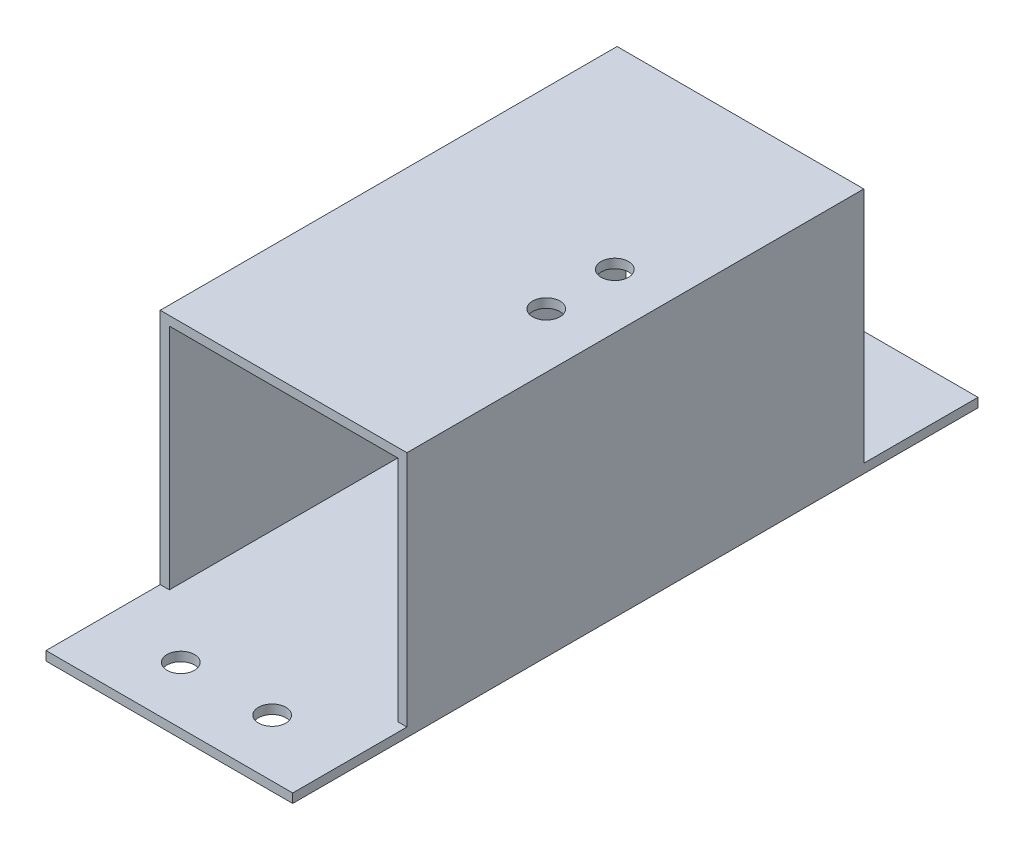
ISO-10303-21;
HEADER;
FILE_DESCRIPTION(('STEP AP214'),'2;1');
FILE_NAME('part.step','',(''),(''),'','','');
FILE_SCHEMA(('AUTOMOTIVE_DESIGN { 1 0 10303 214 1 1 1 1 }'));
ENDSEC;
DATA;
#1=APPLICATION_CONTEXT('core data for automotive mechanical design processes');
#2=APPLICATION_PROTOCOL_DEFINITION('international standard','automotive_design',2000,#1);
#3=PRODUCT_CONTEXT('',#1,'mechanical');
#4=PRODUCT('Part','Part','',(#3));
#5=PRODUCT_RELATED_PRODUCT_CATEGORY('part','',(#4));
#6=PRODUCT_DEFINITION_FORMATION('','',#4);
#7=PRODUCT_DEFINITION_CONTEXT('part definition',#1,'design');
#8=PRODUCT_DEFINITION('design','',#6,#7);
#9=PRODUCT_DEFINITION_SHAPE('','',#8);
#10=(LENGTH_UNIT() NAMED_UNIT(*) SI_UNIT(.MILLI.,.METRE.));
#11=(NAMED_UNIT(*) PLANE_ANGLE_UNIT() SI_UNIT($,.RADIAN.));
#12=(NAMED_UNIT(*) SI_UNIT($,.STERADIAN.) SOLID_ANGLE_UNIT());
#13=UNCERTAINTY_MEASURE_WITH_UNIT(LENGTH_MEASURE(1.E-05),#10,'distance_accuracy_value','');
#14=(GEOMETRIC_REPRESENTATION_CONTEXT(3) GLOBAL_UNCERTAINTY_ASSIGNED_CONTEXT((#13)) GLOBAL_UNIT_ASSIGNED_CONTEXT((#10,
#11,#12)) REPRESENTATION_CONTEXT('',''));
#15=CARTESIAN_POINT('',(0.,0.,0.));
#16=DIRECTION('',(0.,0.,1.));
#17=DIRECTION('',(1.,0.,0.));
#18=AXIS2_PLACEMENT_3D('',#15,#16,#17);
#19=CARTESIAN_POINT('',(0.,0.,50.));
#20=DIRECTION('',(0.,0.,1.));
#21=DIRECTION('',(1.,0.,0.));
#22=AXIS2_PLACEMENT_3D('',#19,#20,#21);
#23=PLANE('',#22);
#24=DIRECTION('',(-1.,0.,0.));
#25=VECTOR('',#24,1.);
#26=CARTESIAN_POINT('',(0.,-25.,50.));
#27=LINE('',#26,#25);
#28=CARTESIAN_POINT('',(27.,-25.,50.));
#29=VERTEX_POINT('',#28);
#30=CARTESIAN_POINT('',(25.,-25.,50.));
#31=VERTEX_POINT('',#30);
#32=EDGE_CURVE('E57',#29,#31,#27,.T.);
#33=ORIENTED_EDGE('',*,*,#32,.F.);
#34=DIRECTION('',(0.,1.,0.));
#35=VECTOR('',#34,1.);
#36=CARTESIAN_POINT('',(27.,-27.,50.));
#37=LINE('',#36,#35);
#38=CARTESIAN_POINT('',(27.,27.,50.));
#39=VERTEX_POINT('',#38);
#40=EDGE_CURVE('E205',#29,#39,#37,.T.);
#41=ORIENTED_EDGE('',*,*,#40,.T.);
#42=DIRECTION('',(-1.,0.,0.));
#43=VECTOR('',#42,1.);
#44=CARTESIAN_POINT('',(27.,27.,50.));
#45=LINE('',#44,#43);
#46=CARTESIAN_POINT('',(-27.,27.,50.));
#47=VERTEX_POINT('',#46);
#48=EDGE_CURVE('E208',#39,#47,#45,.T.);
#49=ORIENTED_EDGE('',*,*,#48,.T.);
#50=DIRECTION('',(0.,-1.,0.));
#51=VECTOR('',#50,1.);
#52=CARTESIAN_POINT('',(-27.,-27.,50.));
#53=LINE('',#52,#51);
#54=CARTESIAN_POINT('',(-27.,-25.,50.));
#55=VERTEX_POINT('',#54);
#56=EDGE_CURVE('E50',#47,#55,#53,.T.);
#57=ORIENTED_EDGE('',*,*,#56,.T.);
#58=CARTESIAN_POINT('',(-25.,-25.,50.));
#59=VERTEX_POINT('',#58);
#60=EDGE_CURVE('E173',#59,#55,#27,.T.);
#61=ORIENTED_EDGE('',*,*,#60,.F.);
#62=DIRECTION('',(0.,-1.,0.));
#63=VECTOR('',#62,1.);
#64=CARTESIAN_POINT('',(-25.,-25.,50.));
#65=LINE('',#64,#63);
#66=CARTESIAN_POINT('',(-25.,25.,50.));
#67=VERTEX_POINT('',#66);
#68=EDGE_CURVE('E176',#67,#59,#65,.T.);
#69=ORIENTED_EDGE('',*,*,#68,.F.);
#70=DIRECTION('',(-1.,0.,0.));
#71=VECTOR('',#70,1.);
#72=CARTESIAN_POINT('',(25.,25.,50.));
#73=LINE('',#72,#71);
#74=CARTESIAN_POINT('',(25.,25.,50.));
#75=VERTEX_POINT('',#74);
#76=EDGE_CURVE('E183',#75,#67,#73,.T.);
#77=ORIENTED_EDGE('',*,*,#76,.F.);
#78=DIRECTION('',(0.,1.,0.));
#79=VECTOR('',#78,1.);
#80=CARTESIAN_POINT('',(25.,-25.,50.));
#81=LINE('',#80,#79);
#82=EDGE_CURVE('E179',#31,#75,#81,.T.);
#83=ORIENTED_EDGE('',*,*,#82,.F.);
#84=EDGE_LOOP('',(#33,#41,#49,#57,#61,#69,#77,#83));
#85=FACE_BOUND('',#84,.T.);
#86=ADVANCED_FACE('F33',(#85),#23,.T.);
#87=CARTESIAN_POINT('',(0.,0.,-50.));
#88=DIRECTION('',(0.,0.,1.));
#89=DIRECTION('',(1.,0.,0.));
#90=AXIS2_PLACEMENT_3D('',#87,#88,#89);
#91=PLANE('',#90);
#92=DIRECTION('',(0.,1.,0.));
#93=VECTOR('',#92,1.);
#94=CARTESIAN_POINT('',(27.,-27.,-50.));
#95=LINE('',#94,#93);
#96=CARTESIAN_POINT('',(27.,-25.,-50.));
#97=VERTEX_POINT('',#96);
#98=CARTESIAN_POINT('',(27.,27.,-50.));
#99=VERTEX_POINT('',#98);
#100=EDGE_CURVE('E212',#97,#99,#95,.T.);
#101=ORIENTED_EDGE('',*,*,#100,.F.);
#102=DIRECTION('',(-1.,0.,0.));
#103=VECTOR('',#102,1.);
#104=CARTESIAN_POINT('',(0.,-25.,-50.));
#105=LINE('',#104,#103);
#106=CARTESIAN_POINT('',(25.,-25.,-50.));
#107=VERTEX_POINT('',#106);
#108=EDGE_CURVE('E171',#97,#107,#105,.T.);
#109=ORIENTED_EDGE('',*,*,#108,.T.);
#110=DIRECTION('',(0.,1.,0.));
#111=VECTOR('',#110,1.);
#112=CARTESIAN_POINT('',(25.,-25.,-50.));
#113=LINE('',#112,#111);
#114=CARTESIAN_POINT('',(25.,25.,-50.));
#115=VERTEX_POINT('',#114);
#116=EDGE_CURVE('E188',#107,#115,#113,.T.);
#117=ORIENTED_EDGE('',*,*,#116,.T.);
#118=DIRECTION('',(-1.,0.,0.));
#119=VECTOR('',#118,1.);
#120=CARTESIAN_POINT('',(25.,25.,-50.));
#121=LINE('',#120,#119);
#122=CARTESIAN_POINT('',(-25.,25.,-50.));
#123=VERTEX_POINT('',#122);
#124=EDGE_CURVE('E180',#115,#123,#121,.T.);
#125=ORIENTED_EDGE('',*,*,#124,.T.);
#126=DIRECTION('',(0.,-1.,0.));
#127=VECTOR('',#126,1.);
#128=CARTESIAN_POINT('',(-25.,-25.,-50.));
#129=LINE('',#128,#127);
#130=CARTESIAN_POINT('',(-25.,-25.,-50.));
#131=VERTEX_POINT('',#130);
#132=EDGE_CURVE('E175',#123,#131,#129,.T.);
#133=ORIENTED_EDGE('',*,*,#132,.T.);
#134=CARTESIAN_POINT('',(-27.,-25.,-50.));
#135=VERTEX_POINT('',#134);
#136=EDGE_CURVE('E166',#131,#135,#105,.T.);
#137=ORIENTED_EDGE('',*,*,#136,.T.);
#138=DIRECTION('',(0.,-1.,0.));
#139=VECTOR('',#138,1.);
#140=CARTESIAN_POINT('',(-27.,-27.,-50.));
#141=LINE('',#140,#139);
#142=CARTESIAN_POINT('',(-27.,27.,-50.));
#143=VERTEX_POINT('',#142);
#144=EDGE_CURVE('E203',#143,#135,#141,.T.);
#145=ORIENTED_EDGE('',*,*,#144,.F.);
#146=DIRECTION('',(-1.,0.,0.));
#147=VECTOR('',#146,1.);
#148=CARTESIAN_POINT('',(27.,27.,-50.));
#149=LINE('',#148,#147);
#150=EDGE_CURVE('E206',#99,#143,#149,.T.);
#151=ORIENTED_EDGE('',*,*,#150,.F.);
#152=EDGE_LOOP('',(#101,#109,#117,#125,#133,#137,#145,#151));
#153=FACE_BOUND('',#152,.T.);
#154=ADVANCED_FACE('F273',(#153),#91,.F.);
#155=CARTESIAN_POINT('',(-27.,-27.,50.));
#156=DIRECTION('',(1.,0.,0.));
#157=DIRECTION('',(0.,0.,-1.));
#158=AXIS2_PLACEMENT_3D('',#155,#156,#157);
#159=PLANE('',#158);
#160=ORIENTED_EDGE('',*,*,#144,.T.);
#161=DIRECTION('',(0.,0.,1.));
#162=VECTOR('',#161,1.);
#163=CARTESIAN_POINT('',(-27.,-25.,-75.));
#164=LINE('',#163,#162);
#165=CARTESIAN_POINT('',(-27.,-25.,-75.));
#166=VERTEX_POINT('',#165);
#167=EDGE_CURVE('E164',#166,#135,#164,.T.);
#168=ORIENTED_EDGE('',*,*,#167,.F.);
#169=DIRECTION('',(0.,-1.,0.));
#170=VECTOR('',#169,1.);
#171=CARTESIAN_POINT('',(-27.,-27.,-75.));
#172=LINE('',#171,#170);
#173=CARTESIAN_POINT('',(-27.,-27.,-75.));
#174=VERTEX_POINT('',#173);
#175=EDGE_CURVE('E129',#166,#174,#172,.T.);
#176=ORIENTED_EDGE('',*,*,#175,.T.);
#177=DIRECTION('',(0.,0.,-1.));
#178=VECTOR('',#177,1.);
#179=CARTESIAN_POINT('',(-27.,-27.,50.));
#180=LINE('',#179,#178);
#181=CARTESIAN_POINT('',(-27.,-27.,75.));
#182=VERTEX_POINT('',#181);
#183=EDGE_CURVE('E11',#182,#174,#180,.T.);
#184=ORIENTED_EDGE('',*,*,#183,.F.);
#185=DIRECTION('',(0.,-1.,0.));
#186=VECTOR('',#185,1.);
#187=CARTESIAN_POINT('',(-27.,-27.,75.));
#188=LINE('',#187,#186);
#189=CARTESIAN_POINT('',(-27.,-25.,75.));
#190=VERTEX_POINT('',#189);
#191=EDGE_CURVE('E127',#190,#182,#188,.T.);
#192=ORIENTED_EDGE('',*,*,#191,.F.);
#193=EDGE_CURVE('E167',#55,#190,#164,.T.);
#194=ORIENTED_EDGE('',*,*,#193,.F.);
#195=ORIENTED_EDGE('',*,*,#56,.F.);
#196=DIRECTION('',(0.,0.,-1.));
#197=VECTOR('',#196,1.);
#198=CARTESIAN_POINT('',(-27.,27.,50.));
#199=LINE('',#198,#197);
#200=EDGE_CURVE('E210',#47,#143,#199,.T.);
#201=ORIENTED_EDGE('',*,*,#200,.T.);
#202=EDGE_LOOP('',(#160,#168,#176,#184,#192,#194,#195,#201));
#203=FACE_BOUND('',#202,.T.);
#204=ADVANCED_FACE('F35',(#203),#159,.F.);
#205=CARTESIAN_POINT('',(27.,-27.,50.));
#206=DIRECTION('',(0.,1.,0.));
#207=DIRECTION('',(-1.,0.,0.));
#208=AXIS2_PLACEMENT_3D('',#205,#206,#207);
#209=PLANE('',#208);
#210=CARTESIAN_POINT('',(-9.99999999999999,-27.,-62.5));
#211=DIRECTION('',(0.,1.,0.));
#212=DIRECTION('',(-1.,0.,0.));
#213=AXIS2_PLACEMENT_3D('',#210,#211,#212);
#214=CIRCLE('',#213,3.);
#215=CARTESIAN_POINT('',(-13.,-27.,-62.5));
#216=VERTEX_POINT('',#215);
#217=EDGE_CURVE('E145',#216,#216,#214,.T.);
#218=ORIENTED_EDGE('',*,*,#217,.T.);
#219=EDGE_LOOP('',(#218));
#220=FACE_BOUND('',#219,.T.);
#221=CARTESIAN_POINT('',(10.,-27.,-62.5));
#222=DIRECTION('',(0.,1.,0.));
#223=DIRECTION('',(-1.,0.,0.));
#224=AXIS2_PLACEMENT_3D('',#221,#222,#223);
#225=CIRCLE('',#224,3.);
#226=CARTESIAN_POINT('',(7.00000000000001,-27.,-62.5));
#227=VERTEX_POINT('',#226);
#228=EDGE_CURVE('E148',#227,#227,#225,.T.);
#229=ORIENTED_EDGE('',*,*,#228,.T.);
#230=EDGE_LOOP('',(#229));
#231=FACE_BOUND('',#230,.T.);
#232=CARTESIAN_POINT('',(10.,-27.,62.5));
#233=DIRECTION('',(0.,1.,0.));
#234=DIRECTION('',(-1.,0.,0.));
#235=AXIS2_PLACEMENT_3D('',#232,#233,#234);
#236=CIRCLE('',#235,3.);
#237=CARTESIAN_POINT('',(7.00000000000001,-27.,62.5));
#238=VERTEX_POINT('',#237);
#239=EDGE_CURVE('E249',#238,#238,#236,.T.);
#240=ORIENTED_EDGE('',*,*,#239,.T.);
#241=EDGE_LOOP('',(#240));
#242=FACE_BOUND('',#241,.T.);
#243=CARTESIAN_POINT('',(-9.99999999999999,-27.,62.5));
#244=DIRECTION('',(0.,1.,0.));
#245=DIRECTION('',(-1.,0.,0.));
#246=AXIS2_PLACEMENT_3D('',#243,#244,#245);
#247=CIRCLE('',#246,3.);
#248=CARTESIAN_POINT('',(-13.,-27.,62.5));
#249=VERTEX_POINT('',#248);
#250=EDGE_CURVE('E246',#249,#249,#247,.T.);
#251=ORIENTED_EDGE('',*,*,#250,.T.);
#252=EDGE_LOOP('',(#251));
#253=FACE_BOUND('',#252,.T.);
#254=ORIENTED_EDGE('',*,*,#183,.T.);
#255=DIRECTION('',(1.,0.,0.));
#256=VECTOR('',#255,1.);
#257=CARTESIAN_POINT('',(-27.,-27.,-75.));
#258=LINE('',#257,#256);
#259=CARTESIAN_POINT('',(27.,-27.,-75.));
#260=VERTEX_POINT('',#259);
#261=EDGE_CURVE('E155',#174,#260,#258,.T.);
#262=ORIENTED_EDGE('',*,*,#261,.T.);
#263=DIRECTION('',(0.,0.,-1.));
#264=VECTOR('',#263,1.);
#265=CARTESIAN_POINT('',(27.,-27.,50.));
#266=LINE('',#265,#264);
#267=CARTESIAN_POINT('',(27.,-27.,75.));
#268=VERTEX_POINT('',#267);
#269=EDGE_CURVE('E42',#268,#260,#266,.T.);
#270=ORIENTED_EDGE('',*,*,#269,.F.);
#271=DIRECTION('',(1.,0.,0.));
#272=VECTOR('',#271,1.);
#273=CARTESIAN_POINT('',(-27.,-27.,75.));
#274=LINE('',#273,#272);
#275=EDGE_CURVE('E134',#182,#268,#274,.T.);
#276=ORIENTED_EDGE('',*,*,#275,.F.);
#277=EDGE_LOOP('',(#254,#262,#270,#276));
#278=FACE_BOUND('',#277,.T.);
#279=ADVANCED_FACE('F135',(#220,#231,#242,#253,#278),#209,.F.);
#280=CARTESIAN_POINT('',(27.,-27.,50.));
#281=DIRECTION('',(-1.,0.,0.));
#282=DIRECTION('',(0.,0.,1.));
#283=AXIS2_PLACEMENT_3D('',#280,#281,#282);
#284=PLANE('',#283);
#285=ORIENTED_EDGE('',*,*,#40,.F.);
#286=DIRECTION('',(0.,0.,1.));
#287=VECTOR('',#286,1.);
#288=CARTESIAN_POINT('',(27.,-25.,-75.));
#289=LINE('',#288,#287);
#290=CARTESIAN_POINT('',(27.,-25.,75.));
#291=VERTEX_POINT('',#290);
#292=EDGE_CURVE('E163',#29,#291,#289,.T.);
#293=ORIENTED_EDGE('',*,*,#292,.T.);
#294=DIRECTION('',(0.,1.,0.));
#295=VECTOR('',#294,1.);
#296=CARTESIAN_POINT('',(27.,-27.,75.));
#297=LINE('',#296,#295);
#298=EDGE_CURVE('E139',#268,#291,#297,.T.);
#299=ORIENTED_EDGE('',*,*,#298,.F.);
#300=ORIENTED_EDGE('',*,*,#269,.T.);
#301=DIRECTION('',(0.,1.,0.));
#302=VECTOR('',#301,1.);
#303=CARTESIAN_POINT('',(27.,-27.,-75.));
#304=LINE('',#303,#302);
#305=CARTESIAN_POINT('',(27.,-25.,-75.));
#306=VERTEX_POINT('',#305);
#307=EDGE_CURVE('E157',#260,#306,#304,.T.);
#308=ORIENTED_EDGE('',*,*,#307,.T.);
#309=EDGE_CURVE('E168',#306,#97,#289,.T.);
#310=ORIENTED_EDGE('',*,*,#309,.T.);
#311=ORIENTED_EDGE('',*,*,#100,.T.);
#312=DIRECTION('',(0.,0.,-1.));
#313=VECTOR('',#312,1.);
#314=CARTESIAN_POINT('',(27.,27.,50.));
#315=LINE('',#314,#313);
#316=EDGE_CURVE('E217',#39,#99,#315,.T.);
#317=ORIENTED_EDGE('',*,*,#316,.F.);
#318=EDGE_LOOP('',(#285,#293,#299,#300,#308,#310,#311,#317));
#319=FACE_BOUND('',#318,.T.);
#320=ADVANCED_FACE('F287',(#319),#284,.F.);
#321=CARTESIAN_POINT('',(27.,27.,50.));
#322=DIRECTION('',(0.,-1.,0.));
#323=DIRECTION('',(1.,0.,0.));
#324=AXIS2_PLACEMENT_3D('',#321,#322,#323);
#325=PLANE('',#324);
#326=CARTESIAN_POINT('',(15.,27.,-7.5));
#327=DIRECTION('',(0.,1.,0.));
#328=DIRECTION('',(-1.,0.,0.));
#329=AXIS2_PLACEMENT_3D('',#326,#327,#328);
#330=CIRCLE('',#329,3.);
#331=CARTESIAN_POINT('',(12.,27.,-7.5));
#332=VERTEX_POINT('',#331);
#333=EDGE_CURVE('E222',#332,#332,#330,.T.);
#334=ORIENTED_EDGE('',*,*,#333,.F.);
#335=EDGE_LOOP('',(#334));
#336=FACE_BOUND('',#335,.T.);
#337=CARTESIAN_POINT('',(15.,27.,7.5));
#338=DIRECTION('',(0.,1.,0.));
#339=DIRECTION('',(-1.,0.,0.));
#340=AXIS2_PLACEMENT_3D('',#337,#338,#339);
#341=CIRCLE('',#340,3.);
#342=CARTESIAN_POINT('',(12.,27.,7.5));
#343=VERTEX_POINT('',#342);
#344=EDGE_CURVE('E228',#343,#343,#341,.T.);
#345=ORIENTED_EDGE('',*,*,#344,.F.);
#346=EDGE_LOOP('',(#345));
#347=FACE_BOUND('',#346,.T.);
#348=ORIENTED_EDGE('',*,*,#150,.T.);
#349=ORIENTED_EDGE('',*,*,#200,.F.);
#350=ORIENTED_EDGE('',*,*,#48,.F.);
#351=ORIENTED_EDGE('',*,*,#316,.T.);
#352=EDGE_LOOP('',(#348,#349,#350,#351));
#353=FACE_BOUND('',#352,.T.);
#354=ADVANCED_FACE('F284',(#336,#347,#353),#325,.F.);
#355=CARTESIAN_POINT('',(-25.,-25.,50.));
#356=DIRECTION('',(1.,0.,0.));
#357=DIRECTION('',(0.,0.,-1.));
#358=AXIS2_PLACEMENT_3D('',#355,#356,#357);
#359=PLANE('',#358);
#360=ORIENTED_EDGE('',*,*,#132,.F.);
#361=DIRECTION('',(0.,0.,-1.));
#362=VECTOR('',#361,1.);
#363=CARTESIAN_POINT('',(-25.,25.,50.));
#364=LINE('',#363,#362);
#365=EDGE_CURVE('E185',#67,#123,#364,.T.);
#366=ORIENTED_EDGE('',*,*,#365,.F.);
#367=ORIENTED_EDGE('',*,*,#68,.T.);
#368=DIRECTION('',(0.,0.,-1.));
#369=VECTOR('',#368,1.);
#370=CARTESIAN_POINT('',(-25.,-25.,50.));
#371=LINE('',#370,#369);
#372=EDGE_CURVE('E200',#59,#131,#371,.T.);
#373=ORIENTED_EDGE('',*,*,#372,.T.);
#374=EDGE_LOOP('',(#360,#366,#367,#373));
#375=FACE_BOUND('',#374,.T.);
#376=ADVANCED_FACE('F281',(#375),#359,.T.);
#377=CARTESIAN_POINT('',(25.,-25.,50.));
#378=DIRECTION('',(0.,1.,0.));
#379=DIRECTION('',(-1.,0.,0.));
#380=AXIS2_PLACEMENT_3D('',#377,#378,#379);
#381=PLANE('',#380);
#382=CARTESIAN_POINT('',(-9.99999999999999,-25.,-62.5));
#383=DIRECTION('',(0.,1.,0.));
#384=DIRECTION('',(1.,0.,0.));
#385=AXIS2_PLACEMENT_3D('',#382,#383,#384);
#386=CIRCLE('',#385,3.);
#387=CARTESIAN_POINT('',(-6.99999999999998,-25.,-62.5));
#388=VERTEX_POINT('',#387);
#389=EDGE_CURVE('E226',#388,#388,#386,.T.);
#390=ORIENTED_EDGE('',*,*,#389,.F.);
#391=EDGE_LOOP('',(#390));
#392=FACE_BOUND('',#391,.T.);
#393=CARTESIAN_POINT('',(10.,-25.,-62.5));
#394=DIRECTION('',(0.,1.,0.));
#395=DIRECTION('',(1.,0.,0.));
#396=AXIS2_PLACEMENT_3D('',#393,#394,#395);
#397=CIRCLE('',#396,3.);
#398=CARTESIAN_POINT('',(13.,-25.,-62.5));
#399=VERTEX_POINT('',#398);
#400=EDGE_CURVE('E239',#399,#399,#397,.T.);
#401=ORIENTED_EDGE('',*,*,#400,.F.);
#402=EDGE_LOOP('',(#401));
#403=FACE_BOUND('',#402,.T.);
#404=CARTESIAN_POINT('',(10.,-25.,62.5));
#405=DIRECTION('',(0.,1.,0.));
#406=DIRECTION('',(-1.,0.,0.));
#407=AXIS2_PLACEMENT_3D('',#404,#405,#406);
#408=CIRCLE('',#407,3.);
#409=CARTESIAN_POINT('',(7.00000000000001,-25.,62.5));
#410=VERTEX_POINT('',#409);
#411=EDGE_CURVE('E235',#410,#410,#408,.T.);
#412=ORIENTED_EDGE('',*,*,#411,.F.);
#413=EDGE_LOOP('',(#412));
#414=FACE_BOUND('',#413,.T.);
#415=CARTESIAN_POINT('',(-9.99999999999999,-25.,62.5));
#416=DIRECTION('',(0.,1.,0.));
#417=DIRECTION('',(-1.,0.,0.));
#418=AXIS2_PLACEMENT_3D('',#415,#416,#417);
#419=CIRCLE('',#418,3.);
#420=CARTESIAN_POINT('',(-13.,-25.,62.5));
#421=VERTEX_POINT('',#420);
#422=EDGE_CURVE('E238',#421,#421,#419,.T.);
#423=ORIENTED_EDGE('',*,*,#422,.F.);
#424=EDGE_LOOP('',(#423));
#425=FACE_BOUND('',#424,.T.);
#426=DIRECTION('',(0.,0.,-1.));
#427=VECTOR('',#426,1.);
#428=CARTESIAN_POINT('',(25.,-25.,50.));
#429=LINE('',#428,#427);
#430=EDGE_CURVE('E197',#31,#107,#429,.T.);
#431=ORIENTED_EDGE('',*,*,#430,.T.);
#432=ORIENTED_EDGE('',*,*,#108,.F.);
#433=ORIENTED_EDGE('',*,*,#309,.F.);
#434=DIRECTION('',(-1.,0.,0.));
#435=VECTOR('',#434,1.);
#436=CARTESIAN_POINT('',(-27.,-25.,-75.));
#437=LINE('',#436,#435);
#438=EDGE_CURVE('E160',#306,#166,#437,.T.);
#439=ORIENTED_EDGE('',*,*,#438,.T.);
#440=ORIENTED_EDGE('',*,*,#167,.T.);
#441=ORIENTED_EDGE('',*,*,#136,.F.);
#442=ORIENTED_EDGE('',*,*,#372,.F.);
#443=ORIENTED_EDGE('',*,*,#60,.T.);
#444=ORIENTED_EDGE('',*,*,#193,.T.);
#445=DIRECTION('',(-1.,0.,0.));
#446=VECTOR('',#445,1.);
#447=CARTESIAN_POINT('',(-27.,-25.,75.));
#448=LINE('',#447,#446);
#449=EDGE_CURVE('E144',#291,#190,#448,.T.);
#450=ORIENTED_EDGE('',*,*,#449,.F.);
#451=ORIENTED_EDGE('',*,*,#292,.F.);
#452=ORIENTED_EDGE('',*,*,#32,.T.);
#453=EDGE_LOOP('',(#431,#432,#433,#439,#440,#441,#442,#443,#444,#450,#451,#452));
#454=FACE_BOUND('',#453,.T.);
#455=ADVANCED_FACE('F345',(#392,#403,#414,#425,#454),#381,.T.);
#456=CARTESIAN_POINT('',(25.,-25.,50.));
#457=DIRECTION('',(-1.,0.,0.));
#458=DIRECTION('',(0.,-1.,0.));
#459=AXIS2_PLACEMENT_3D('',#456,#457,#458);
#460=PLANE('',#459);
#461=ORIENTED_EDGE('',*,*,#116,.F.);
#462=ORIENTED_EDGE('',*,*,#430,.F.);
#463=ORIENTED_EDGE('',*,*,#82,.T.);
#464=DIRECTION('',(0.,0.,-1.));
#465=VECTOR('',#464,1.);
#466=CARTESIAN_POINT('',(25.,25.,50.));
#467=LINE('',#466,#465);
#468=EDGE_CURVE('E195',#75,#115,#467,.T.);
#469=ORIENTED_EDGE('',*,*,#468,.T.);
#470=EDGE_LOOP('',(#461,#462,#463,#469));
#471=FACE_BOUND('',#470,.T.);
#472=ADVANCED_FACE('F353',(#471),#460,.T.);
#473=CARTESIAN_POINT('',(25.,25.,50.));
#474=DIRECTION('',(0.,-1.,0.));
#475=DIRECTION('',(1.,0.,0.));
#476=AXIS2_PLACEMENT_3D('',#473,#474,#475);
#477=PLANE('',#476);
#478=CARTESIAN_POINT('',(15.,25.,-7.5));
#479=DIRECTION('',(0.,-1.,0.));
#480=DIRECTION('',(1.,0.,0.));
#481=AXIS2_PLACEMENT_3D('',#478,#479,#480);
#482=CIRCLE('',#481,3.);
#483=CARTESIAN_POINT('',(18.,25.,-7.5));
#484=VERTEX_POINT('',#483);
#485=EDGE_CURVE('E37',#484,#484,#482,.T.);
#486=ORIENTED_EDGE('',*,*,#485,.F.);
#487=EDGE_LOOP('',(#486));
#488=FACE_BOUND('',#487,.T.);
#489=CARTESIAN_POINT('',(15.,25.,7.5));
#490=DIRECTION('',(0.,-1.,0.));
#491=DIRECTION('',(1.,0.,0.));
#492=AXIS2_PLACEMENT_3D('',#489,#490,#491);
#493=CIRCLE('',#492,3.);
#494=CARTESIAN_POINT('',(18.,25.,7.5));
#495=VERTEX_POINT('',#494);
#496=EDGE_CURVE('E220',#495,#495,#493,.T.);
#497=ORIENTED_EDGE('',*,*,#496,.F.);
#498=EDGE_LOOP('',(#497));
#499=FACE_BOUND('',#498,.T.);
#500=ORIENTED_EDGE('',*,*,#124,.F.);
#501=ORIENTED_EDGE('',*,*,#468,.F.);
#502=ORIENTED_EDGE('',*,*,#76,.T.);
#503=ORIENTED_EDGE('',*,*,#365,.T.);
#504=EDGE_LOOP('',(#500,#501,#502,#503));
#505=FACE_BOUND('',#504,.T.);
#506=ADVANCED_FACE('F362',(#488,#499,#505),#477,.T.);
#507=CARTESIAN_POINT('',(0.,0.,-75.));
#508=DIRECTION('',(0.,0.,-1.));
#509=DIRECTION('',(-1.,0.,0.));
#510=AXIS2_PLACEMENT_3D('',#507,#508,#509);
#511=PLANE('',#510);
#512=ORIENTED_EDGE('',*,*,#175,.F.);
#513=ORIENTED_EDGE('',*,*,#438,.F.);
#514=ORIENTED_EDGE('',*,*,#307,.F.);
#515=ORIENTED_EDGE('',*,*,#261,.F.);
#516=EDGE_LOOP('',(#512,#513,#514,#515));
#517=FACE_BOUND('',#516,.T.);
#518=ADVANCED_FACE('F370',(#517),#511,.T.);
#519=CARTESIAN_POINT('',(0.,0.,75.));
#520=DIRECTION('',(0.,0.,-1.));
#521=DIRECTION('',(-1.,0.,0.));
#522=AXIS2_PLACEMENT_3D('',#519,#520,#521);
#523=PLANE('',#522);
#524=ORIENTED_EDGE('',*,*,#191,.T.);
#525=ORIENTED_EDGE('',*,*,#275,.T.);
#526=ORIENTED_EDGE('',*,*,#298,.T.);
#527=ORIENTED_EDGE('',*,*,#449,.T.);
#528=EDGE_LOOP('',(#524,#525,#526,#527));
#529=FACE_BOUND('',#528,.T.);
#530=ADVANCED_FACE('F142',(#529),#523,.F.);
#531=CARTESIAN_POINT('',(-9.99999999999998,-50.,62.5));
#532=DIRECTION('',(0.,1.,0.));
#533=DIRECTION('',(-1.,0.,0.));
#534=AXIS2_PLACEMENT_3D('',#531,#532,#533);
#535=CYLINDRICAL_SURFACE('',#534,3.);
#536=ORIENTED_EDGE('',*,*,#422,.T.);
#537=EDGE_LOOP('',(#536));
#538=FACE_BOUND('',#537,.T.);
#539=ORIENTED_EDGE('',*,*,#250,.F.);
#540=EDGE_LOOP('',(#539));
#541=FACE_BOUND('',#540,.T.);
#542=ADVANCED_FACE('F269',(#538,#541),#535,.F.);
#543=CARTESIAN_POINT('',(10.,-50.,62.5));
#544=DIRECTION('',(0.,1.,0.));
#545=DIRECTION('',(-1.,0.,0.));
#546=AXIS2_PLACEMENT_3D('',#543,#544,#545);
#547=CYLINDRICAL_SURFACE('',#546,3.);
#548=ORIENTED_EDGE('',*,*,#411,.T.);
#549=EDGE_LOOP('',(#548));
#550=FACE_BOUND('',#549,.T.);
#551=ORIENTED_EDGE('',*,*,#239,.F.);
#552=EDGE_LOOP('',(#551));
#553=FACE_BOUND('',#552,.T.);
#554=ADVANCED_FACE('F259',(#550,#553),#547,.F.);
#555=CARTESIAN_POINT('',(10.,-50.,-62.5));
#556=DIRECTION('',(0.,1.,0.));
#557=DIRECTION('',(-1.,0.,0.));
#558=AXIS2_PLACEMENT_3D('',#555,#556,#557);
#559=CYLINDRICAL_SURFACE('',#558,3.);
#560=ORIENTED_EDGE('',*,*,#400,.T.);
#561=EDGE_LOOP('',(#560));
#562=FACE_BOUND('',#561,.T.);
#563=ORIENTED_EDGE('',*,*,#228,.F.);
#564=EDGE_LOOP('',(#563));
#565=FACE_BOUND('',#564,.T.);
#566=ADVANCED_FACE('F256',(#562,#565),#559,.F.);
#567=CARTESIAN_POINT('',(-9.99999999999998,-50.,-62.5));
#568=DIRECTION('',(0.,1.,0.));
#569=DIRECTION('',(-1.,0.,0.));
#570=AXIS2_PLACEMENT_3D('',#567,#568,#569);
#571=CYLINDRICAL_SURFACE('',#570,3.);
#572=ORIENTED_EDGE('',*,*,#389,.T.);
#573=EDGE_LOOP('',(#572));
#574=FACE_BOUND('',#573,.T.);
#575=ORIENTED_EDGE('',*,*,#217,.F.);
#576=EDGE_LOOP('',(#575));
#577=FACE_BOUND('',#576,.T.);
#578=ADVANCED_FACE('F258',(#574,#577),#571,.F.);
#579=CARTESIAN_POINT('',(15.,2.00000000000001,7.5));
#580=DIRECTION('',(0.,1.,0.));
#581=DIRECTION('',(-1.,0.,0.));
#582=AXIS2_PLACEMENT_3D('',#579,#580,#581);
#583=CYLINDRICAL_SURFACE('',#582,3.);
#584=ORIENTED_EDGE('',*,*,#496,.T.);
#585=EDGE_LOOP('',(#584));
#586=FACE_BOUND('',#585,.T.);
#587=ORIENTED_EDGE('',*,*,#344,.T.);
#588=EDGE_LOOP('',(#587));
#589=FACE_BOUND('',#588,.T.);
#590=ADVANCED_FACE('F266',(#586,#589),#583,.F.);
#591=CARTESIAN_POINT('',(15.,2.00000000000001,-7.5));
#592=DIRECTION('',(0.,1.,0.));
#593=DIRECTION('',(-1.,0.,0.));
#594=AXIS2_PLACEMENT_3D('',#591,#592,#593);
#595=CYLINDRICAL_SURFACE('',#594,3.);
#596=ORIENTED_EDGE('',*,*,#485,.T.);
#597=EDGE_LOOP('',(#596));
#598=FACE_BOUND('',#597,.T.);
#599=ORIENTED_EDGE('',*,*,#333,.T.);
#600=EDGE_LOOP('',(#599));
#601=FACE_BOUND('',#600,.T.);
#602=ADVANCED_FACE('F381',(#598,#601),#595,.F.);
#603=CLOSED_SHELL('',(#86,#154,#204,#279,#320,#354,#376,#455,#472,#506,#518,#530,#542,#554,#566,
#578,#590,#602));
#604=MANIFOLD_SOLID_BREP('B2',#603);
#605=ADVANCED_BREP_SHAPE_REPRESENTATION('',(#18,#604),#14);
#606=SHAPE_DEFINITION_REPRESENTATION(#9,#605);
ENDSEC;
END-ISO-10303-21;
